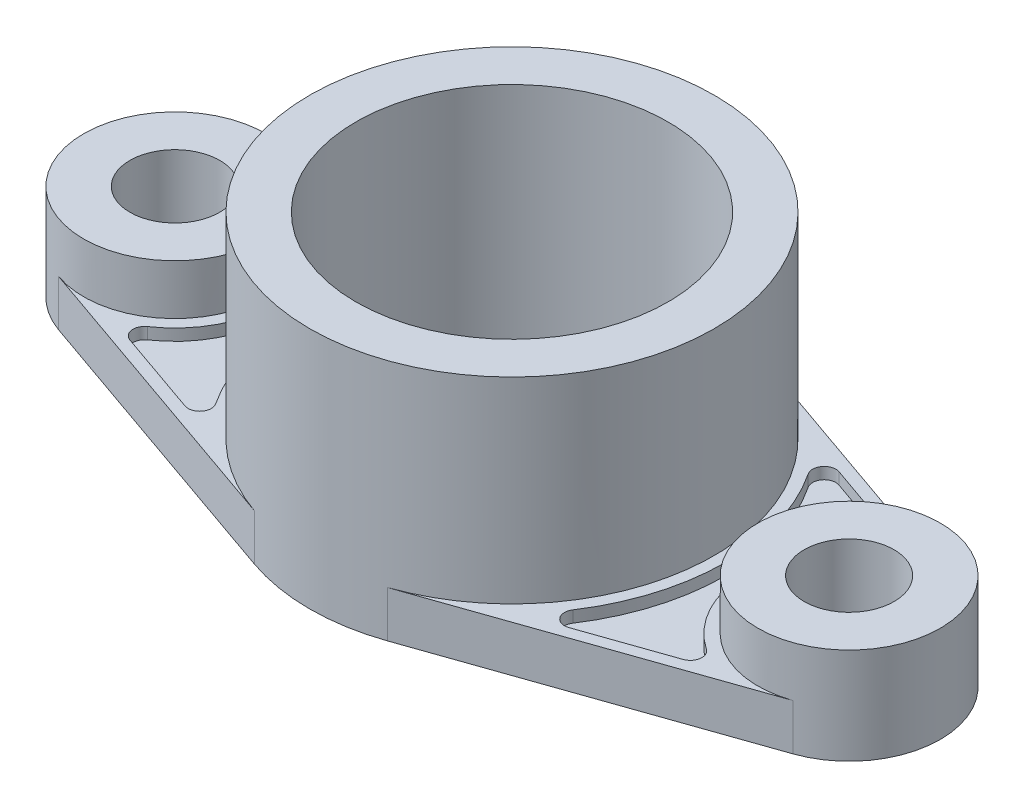
ISO-10303-21;
HEADER;
FILE_DESCRIPTION(('STEP AP214'),'2;1');
FILE_NAME('part.step','',(''),(''),'','','');
FILE_SCHEMA(('AUTOMOTIVE_DESIGN { 1 0 10303 214 1 1 1 1 }'));
ENDSEC;
DATA;
#1=APPLICATION_CONTEXT('core data for automotive mechanical design processes');
#2=APPLICATION_PROTOCOL_DEFINITION('international standard','automotive_design',2000,#1);
#3=PRODUCT_CONTEXT('',#1,'mechanical');
#4=PRODUCT('Part','Part','',(#3));
#5=PRODUCT_RELATED_PRODUCT_CATEGORY('part','',(#4));
#6=PRODUCT_DEFINITION_FORMATION('','',#4);
#7=PRODUCT_DEFINITION_CONTEXT('part definition',#1,'design');
#8=PRODUCT_DEFINITION('design','',#6,#7);
#9=PRODUCT_DEFINITION_SHAPE('','',#8);
#10=(LENGTH_UNIT() NAMED_UNIT(*) SI_UNIT(.MILLI.,.METRE.));
#11=(NAMED_UNIT(*) PLANE_ANGLE_UNIT() SI_UNIT($,.RADIAN.));
#12=(NAMED_UNIT(*) SI_UNIT($,.STERADIAN.) SOLID_ANGLE_UNIT());
#13=UNCERTAINTY_MEASURE_WITH_UNIT(LENGTH_MEASURE(1.E-05),#10,'distance_accuracy_value','');
#14=(GEOMETRIC_REPRESENTATION_CONTEXT(3) GLOBAL_UNCERTAINTY_ASSIGNED_CONTEXT((#13)) GLOBAL_UNIT_ASSIGNED_CONTEXT((#10,
#11,#12)) REPRESENTATION_CONTEXT('',''));
#15=CARTESIAN_POINT('',(0.,0.,0.));
#16=DIRECTION('',(0.,0.,1.));
#17=DIRECTION('',(1.,0.,0.));
#18=AXIS2_PLACEMENT_3D('',#15,#16,#17);
#19=CARTESIAN_POINT('',(0.,9.,0.));
#20=DIRECTION('',(0.,-1.,0.));
#21=DIRECTION('',(0.,0.,-1.));
#22=AXIS2_PLACEMENT_3D('',#19,#20,#21);
#23=CYLINDRICAL_SURFACE('',#22,52.5);
#24=CARTESIAN_POINT('',(0.,63.,0.));
#25=DIRECTION('',(0.,1.,0.));
#26=DIRECTION('',(0.,0.,1.));
#27=AXIS2_PLACEMENT_3D('',#24,#25,#26);
#28=CIRCLE('',#27,52.5);
#29=CARTESIAN_POINT('',(0.,63.,52.5));
#30=VERTEX_POINT('',#29);
#31=EDGE_CURVE('E343',#30,#30,#28,.F.);
#32=ORIENTED_EDGE('',*,*,#31,.T.);
#33=EDGE_LOOP('',(#32));
#34=FACE_BOUND('',#33,.T.);
#35=DIRECTION('',(0.,-1.,0.));
#36=VECTOR('',#35,1.);
#37=CARTESIAN_POINT('',(-17.3,9.,-49.5677314389109));
#38=LINE('',#37,#36);
#39=CARTESIAN_POINT('',(-17.3,12.,-49.5677314389109));
#40=VERTEX_POINT('',#39);
#41=CARTESIAN_POINT('',(-17.3,0.,-49.5677314389109));
#42=VERTEX_POINT('',#41);
#43=EDGE_CURVE('E394',#40,#42,#38,.T.);
#44=ORIENTED_EDGE('',*,*,#43,.F.);
#45=CARTESIAN_POINT('',(0.,12.,0.));
#46=DIRECTION('',(0.,-1.,0.));
#47=DIRECTION('',(0.,0.,1.));
#48=AXIS2_PLACEMENT_3D('',#45,#46,#47);
#49=CIRCLE('',#48,52.5);
#50=CARTESIAN_POINT('',(-17.3,12.,49.5677314389109));
#51=VERTEX_POINT('',#50);
#52=EDGE_CURVE('E212',#51,#40,#49,.T.);
#53=ORIENTED_EDGE('',*,*,#52,.F.);
#54=DIRECTION('',(0.,-1.,0.));
#55=VECTOR('',#54,1.);
#56=CARTESIAN_POINT('',(-17.3,9.,49.5677314389109));
#57=LINE('',#56,#55);
#58=CARTESIAN_POINT('',(-17.3,0.,49.5677314389109));
#59=VERTEX_POINT('',#58);
#60=EDGE_CURVE('E46',#51,#59,#57,.T.);
#61=ORIENTED_EDGE('',*,*,#60,.T.);
#62=CARTESIAN_POINT('',(0.,0.,0.));
#63=DIRECTION('',(0.,1.,0.));
#64=DIRECTION('',(0.,0.,1.));
#65=AXIS2_PLACEMENT_3D('',#62,#63,#64);
#66=CIRCLE('',#65,52.5);
#67=CARTESIAN_POINT('',(17.3,0.,49.5677314389109));
#68=VERTEX_POINT('',#67);
#69=EDGE_CURVE('E370',#68,#59,#66,.F.);
#70=ORIENTED_EDGE('',*,*,#69,.F.);
#71=DIRECTION('',(0.,-1.,0.));
#72=VECTOR('',#71,1.);
#73=CARTESIAN_POINT('',(17.3,9.,49.5677314389109));
#74=LINE('',#73,#72);
#75=CARTESIAN_POINT('',(17.3,12.,49.5677314389109));
#76=VERTEX_POINT('',#75);
#77=EDGE_CURVE('E403',#76,#68,#74,.T.);
#78=ORIENTED_EDGE('',*,*,#77,.F.);
#79=CARTESIAN_POINT('',(0.,12.,0.));
#80=DIRECTION('',(0.,-1.,0.));
#81=DIRECTION('',(0.,0.,1.));
#82=AXIS2_PLACEMENT_3D('',#79,#80,#81);
#83=CIRCLE('',#82,52.5);
#84=CARTESIAN_POINT('',(17.3,12.,-49.5677314389109));
#85=VERTEX_POINT('',#84);
#86=EDGE_CURVE('E331',#85,#76,#83,.T.);
#87=ORIENTED_EDGE('',*,*,#86,.F.);
#88=DIRECTION('',(0.,-1.,0.));
#89=VECTOR('',#88,1.);
#90=CARTESIAN_POINT('',(17.3,9.,-49.5677314389109));
#91=LINE('',#90,#89);
#92=CARTESIAN_POINT('',(17.3,0.,-49.5677314389109));
#93=VERTEX_POINT('',#92);
#94=EDGE_CURVE('E396',#85,#93,#91,.T.);
#95=ORIENTED_EDGE('',*,*,#94,.T.);
#96=EDGE_CURVE('E374',#42,#93,#66,.F.);
#97=ORIENTED_EDGE('',*,*,#96,.F.);
#98=EDGE_LOOP('',(#44,#53,#61,#70,#78,#87,#95,#97));
#99=FACE_BOUND('',#98,.T.);
#100=ADVANCED_FACE('F38',(#34,#99),#23,.T.);
#101=CARTESIAN_POINT('',(-87.5,9.,0.));
#102=DIRECTION('',(0.,-1.,0.));
#103=DIRECTION('',(0.,0.,-1.));
#104=AXIS2_PLACEMENT_3D('',#101,#102,#103);
#105=CYLINDRICAL_SURFACE('',#104,23.6666666666667);
#106=CARTESIAN_POINT('',(-87.5,12.,0.));
#107=DIRECTION('',(0.,-1.,0.));
#108=DIRECTION('',(0.,0.,1.));
#109=AXIS2_PLACEMENT_3D('',#106,#107,#108);
#110=CIRCLE('',#109,23.6666666666667);
#111=CARTESIAN_POINT('',(-95.2987301587302,12.,-22.3448186169059));
#112=VERTEX_POINT('',#111);
#113=CARTESIAN_POINT('',(-95.2987301587301,12.,22.3448186169059));
#114=VERTEX_POINT('',#113);
#115=EDGE_CURVE('E268',#112,#114,#110,.T.);
#116=ORIENTED_EDGE('',*,*,#115,.F.);
#117=DIRECTION('',(0.,-1.,0.));
#118=VECTOR('',#117,1.);
#119=CARTESIAN_POINT('',(-95.2987301587302,9.,-22.3448186169059));
#120=LINE('',#119,#118);
#121=CARTESIAN_POINT('',(-95.2987301587302,0.,-22.3448186169059));
#122=VERTEX_POINT('',#121);
#123=EDGE_CURVE('E392',#112,#122,#120,.T.);
#124=ORIENTED_EDGE('',*,*,#123,.T.);
#125=CARTESIAN_POINT('',(-87.5,0.,0.));
#126=DIRECTION('',(0.,1.,0.));
#127=DIRECTION('',(0.,0.,1.));
#128=AXIS2_PLACEMENT_3D('',#125,#126,#127);
#129=CIRCLE('',#128,23.6666666666667);
#130=CARTESIAN_POINT('',(-95.2987301587301,0.,22.3448186169059));
#131=VERTEX_POINT('',#130);
#132=EDGE_CURVE('E364',#131,#122,#129,.F.);
#133=ORIENTED_EDGE('',*,*,#132,.F.);
#134=DIRECTION('',(0.,-1.,0.));
#135=VECTOR('',#134,1.);
#136=CARTESIAN_POINT('',(-95.2987301587301,9.,22.3448186169059));
#137=LINE('',#136,#135);
#138=EDGE_CURVE('E12',#114,#131,#137,.T.);
#139=ORIENTED_EDGE('',*,*,#138,.F.);
#140=EDGE_LOOP('',(#116,#124,#133,#139));
#141=FACE_BOUND('',#140,.T.);
#142=CARTESIAN_POINT('',(-87.5,25.,0.));
#143=DIRECTION('',(0.,1.,0.));
#144=DIRECTION('',(0.,0.,1.));
#145=AXIS2_PLACEMENT_3D('',#142,#143,#144);
#146=CIRCLE('',#145,23.6666666666667);
#147=CARTESIAN_POINT('',(-87.5,25.,23.6666666666667));
#148=VERTEX_POINT('',#147);
#149=EDGE_CURVE('E355',#148,#148,#146,.F.);
#150=ORIENTED_EDGE('',*,*,#149,.T.);
#151=EDGE_LOOP('',(#150));
#152=FACE_BOUND('',#151,.T.);
#153=ADVANCED_FACE('F437',(#141,#152),#105,.T.);
#154=CARTESIAN_POINT('',(-17.3,9.,49.5677314389109));
#155=DIRECTION('',(-0.329523809523809,0.,0.944147265503065));
#156=DIRECTION('',(0.944147265503066,0.,0.329523809523809));
#157=AXIS2_PLACEMENT_3D('',#154,#155,#156);
#158=PLANE('',#157);
#159=DIRECTION('',(-0.944147265503066,0.,-0.329523809523809));
#160=VECTOR('',#159,1.);
#161=CARTESIAN_POINT('',(-17.3,0.,49.5677314389109));
#162=LINE('',#161,#160);
#163=EDGE_CURVE('E367',#59,#131,#162,.T.);
#164=ORIENTED_EDGE('',*,*,#163,.F.);
#165=ORIENTED_EDGE('',*,*,#60,.F.);
#166=DIRECTION('',(0.944147265503065,0.,0.329523809523809));
#167=VECTOR('',#166,1.);
#168=CARTESIAN_POINT('',(-95.2987301587301,12.,22.3448186169059));
#169=LINE('',#168,#167);
#170=EDGE_CURVE('E271',#114,#51,#169,.T.);
#171=ORIENTED_EDGE('',*,*,#170,.F.);
#172=ORIENTED_EDGE('',*,*,#138,.T.);
#173=EDGE_LOOP('',(#164,#165,#171,#172));
#174=FACE_BOUND('',#173,.T.);
#175=ADVANCED_FACE('F410',(#174),#158,.T.);
#176=CARTESIAN_POINT('',(17.3,9.,49.5677314389109));
#177=DIRECTION('',(-0.329523809523809,0.,-0.944147265503065));
#178=DIRECTION('',(-0.944147265503066,0.,0.329523809523809));
#179=AXIS2_PLACEMENT_3D('',#176,#177,#178);
#180=PLANE('',#179);
#181=DIRECTION('',(0.944147265503066,0.,-0.329523809523809));
#182=VECTOR('',#181,1.);
#183=CARTESIAN_POINT('',(17.3,0.,49.5677314389109));
#184=LINE('',#183,#182);
#185=CARTESIAN_POINT('',(95.2987301587302,0.,22.3448186169059));
#186=VERTEX_POINT('',#185);
#187=EDGE_CURVE('E373',#68,#186,#184,.T.);
#188=ORIENTED_EDGE('',*,*,#187,.T.);
#189=DIRECTION('',(0.,-1.,0.));
#190=VECTOR('',#189,1.);
#191=CARTESIAN_POINT('',(95.2987301587302,9.,22.3448186169059));
#192=LINE('',#191,#190);
#193=CARTESIAN_POINT('',(95.2987301587302,12.,22.3448186169059));
#194=VERTEX_POINT('',#193);
#195=EDGE_CURVE('E400',#194,#186,#192,.T.);
#196=ORIENTED_EDGE('',*,*,#195,.F.);
#197=DIRECTION('',(0.944147265503066,0.,-0.329523809523809));
#198=VECTOR('',#197,1.);
#199=CARTESIAN_POINT('',(17.3,12.,49.5677314389109));
#200=LINE('',#199,#198);
#201=EDGE_CURVE('E334',#76,#194,#200,.T.);
#202=ORIENTED_EDGE('',*,*,#201,.F.);
#203=ORIENTED_EDGE('',*,*,#77,.T.);
#204=EDGE_LOOP('',(#188,#196,#202,#203));
#205=FACE_BOUND('',#204,.T.);
#206=ADVANCED_FACE('F418',(#205),#180,.F.);
#207=CARTESIAN_POINT('',(87.5,9.,0.));
#208=DIRECTION('',(0.,-1.,0.));
#209=DIRECTION('',(0.,0.,-1.));
#210=AXIS2_PLACEMENT_3D('',#207,#208,#209);
#211=CYLINDRICAL_SURFACE('',#210,23.6666666666667);
#212=CARTESIAN_POINT('',(87.5,12.,0.));
#213=DIRECTION('',(0.,-1.,0.));
#214=DIRECTION('',(0.,0.,1.));
#215=AXIS2_PLACEMENT_3D('',#212,#213,#214);
#216=CIRCLE('',#215,23.6666666666667);
#217=CARTESIAN_POINT('',(95.2987301587302,12.,-22.3448186169059));
#218=VERTEX_POINT('',#217);
#219=EDGE_CURVE('E337',#194,#218,#216,.T.);
#220=ORIENTED_EDGE('',*,*,#219,.F.);
#221=ORIENTED_EDGE('',*,*,#195,.T.);
#222=CARTESIAN_POINT('',(87.5,0.,0.));
#223=DIRECTION('',(0.,1.,0.));
#224=DIRECTION('',(0.,0.,1.));
#225=AXIS2_PLACEMENT_3D('',#222,#223,#224);
#226=CIRCLE('',#225,23.6666666666667);
#227=CARTESIAN_POINT('',(95.2987301587302,0.,-22.3448186169059));
#228=VERTEX_POINT('',#227);
#229=EDGE_CURVE('E377',#186,#228,#226,.T.);
#230=ORIENTED_EDGE('',*,*,#229,.T.);
#231=DIRECTION('',(0.,-1.,0.));
#232=VECTOR('',#231,1.);
#233=CARTESIAN_POINT('',(95.2987301587302,9.,-22.3448186169059));
#234=LINE('',#233,#232);
#235=EDGE_CURVE('E398',#218,#228,#234,.T.);
#236=ORIENTED_EDGE('',*,*,#235,.F.);
#237=EDGE_LOOP('',(#220,#221,#230,#236));
#238=FACE_BOUND('',#237,.T.);
#239=CARTESIAN_POINT('',(87.5,25.,0.));
#240=DIRECTION('',(0.,1.,0.));
#241=DIRECTION('',(0.,0.,1.));
#242=AXIS2_PLACEMENT_3D('',#239,#240,#241);
#243=CIRCLE('',#242,23.6666666666667);
#244=CARTESIAN_POINT('',(87.5,25.,23.6666666666667));
#245=VERTEX_POINT('',#244);
#246=EDGE_CURVE('E352',#245,#245,#243,.T.);
#247=ORIENTED_EDGE('',*,*,#246,.F.);
#248=EDGE_LOOP('',(#247));
#249=FACE_BOUND('',#248,.T.);
#250=ADVANCED_FACE('F458',(#238,#249),#211,.T.);
#251=CARTESIAN_POINT('',(17.3,9.,-49.5677314389109));
#252=DIRECTION('',(0.329523809523809,0.,-0.944147265503065));
#253=DIRECTION('',(-0.944147265503066,0.,-0.329523809523809));
#254=AXIS2_PLACEMENT_3D('',#251,#252,#253);
#255=PLANE('',#254);
#256=DIRECTION('',(0.944147265503066,0.,0.329523809523809));
#257=VECTOR('',#256,1.);
#258=CARTESIAN_POINT('',(17.3,0.,-49.5677314389109));
#259=LINE('',#258,#257);
#260=EDGE_CURVE('E380',#93,#228,#259,.T.);
#261=ORIENTED_EDGE('',*,*,#260,.F.);
#262=ORIENTED_EDGE('',*,*,#94,.F.);
#263=DIRECTION('',(-0.944147265503065,0.,-0.329523809523809));
#264=VECTOR('',#263,1.);
#265=CARTESIAN_POINT('',(95.2987301587302,12.,-22.3448186169059));
#266=LINE('',#265,#264);
#267=EDGE_CURVE('E340',#218,#85,#266,.T.);
#268=ORIENTED_EDGE('',*,*,#267,.F.);
#269=ORIENTED_EDGE('',*,*,#235,.T.);
#270=EDGE_LOOP('',(#261,#262,#268,#269));
#271=FACE_BOUND('',#270,.T.);
#272=ADVANCED_FACE('F429',(#271),#255,.T.);
#273=CARTESIAN_POINT('',(-87.5,9.,0.));
#274=DIRECTION('',(0.,-1.,0.));
#275=DIRECTION('',(0.,0.,-1.));
#276=AXIS2_PLACEMENT_3D('',#273,#274,#275);
#277=CYLINDRICAL_SURFACE('',#276,11.6666666666667);
#278=CARTESIAN_POINT('',(-87.5,0.,0.));
#279=DIRECTION('',(0.,1.,0.));
#280=DIRECTION('',(0.,0.,1.));
#281=AXIS2_PLACEMENT_3D('',#278,#279,#280);
#282=CIRCLE('',#281,11.6666666666667);
#283=CARTESIAN_POINT('',(-87.5,0.,11.6666666666667));
#284=VERTEX_POINT('',#283);
#285=EDGE_CURVE('E386',#284,#284,#282,.F.);
#286=ORIENTED_EDGE('',*,*,#285,.T.);
#287=EDGE_LOOP('',(#286));
#288=FACE_BOUND('',#287,.T.);
#289=CARTESIAN_POINT('',(-87.5,25.,0.));
#290=DIRECTION('',(0.,1.,0.));
#291=DIRECTION('',(0.,0.,1.));
#292=AXIS2_PLACEMENT_3D('',#289,#290,#291);
#293=CIRCLE('',#292,11.6666666666667);
#294=CARTESIAN_POINT('',(-87.5,25.,11.6666666666667));
#295=VERTEX_POINT('',#294);
#296=EDGE_CURVE('E358',#295,#295,#293,.F.);
#297=ORIENTED_EDGE('',*,*,#296,.F.);
#298=EDGE_LOOP('',(#297));
#299=FACE_BOUND('',#298,.T.);
#300=ADVANCED_FACE('F449',(#288,#299),#277,.F.);
#301=CARTESIAN_POINT('',(-17.3,9.,-49.5677314389109));
#302=DIRECTION('',(0.32952380952381,0.,0.944147265503065));
#303=DIRECTION('',(0.944147265503066,0.,-0.32952380952381));
#304=AXIS2_PLACEMENT_3D('',#301,#302,#303);
#305=PLANE('',#304);
#306=DIRECTION('',(-0.944147265503066,0.,0.32952380952381));
#307=VECTOR('',#306,1.);
#308=CARTESIAN_POINT('',(-17.3,0.,-49.5677314389109));
#309=LINE('',#308,#307);
#310=EDGE_CURVE('E383',#42,#122,#309,.T.);
#311=ORIENTED_EDGE('',*,*,#310,.T.);
#312=ORIENTED_EDGE('',*,*,#123,.F.);
#313=DIRECTION('',(-0.944147265503066,0.,0.32952380952381));
#314=VECTOR('',#313,1.);
#315=CARTESIAN_POINT('',(-17.3,12.,-49.5677314389109));
#316=LINE('',#315,#314);
#317=EDGE_CURVE('E265',#40,#112,#316,.T.);
#318=ORIENTED_EDGE('',*,*,#317,.F.);
#319=ORIENTED_EDGE('',*,*,#43,.T.);
#320=EDGE_LOOP('',(#311,#312,#318,#319));
#321=FACE_BOUND('',#320,.T.);
#322=ADVANCED_FACE('F433',(#321),#305,.F.);
#323=CARTESIAN_POINT('',(0.,9.,0.));
#324=DIRECTION('',(0.,-1.,0.));
#325=DIRECTION('',(0.,0.,-1.));
#326=AXIS2_PLACEMENT_3D('',#323,#324,#325);
#327=CYLINDRICAL_SURFACE('',#326,40.5);
#328=CARTESIAN_POINT('',(0.,0.,0.));
#329=DIRECTION('',(0.,1.,0.));
#330=DIRECTION('',(0.,0.,1.));
#331=AXIS2_PLACEMENT_3D('',#328,#329,#330);
#332=CIRCLE('',#331,40.5);
#333=CARTESIAN_POINT('',(0.,0.,40.5));
#334=VERTEX_POINT('',#333);
#335=EDGE_CURVE('E361',#334,#334,#332,.F.);
#336=ORIENTED_EDGE('',*,*,#335,.T.);
#337=EDGE_LOOP('',(#336));
#338=FACE_BOUND('',#337,.T.);
#339=CARTESIAN_POINT('',(0.,63.,0.));
#340=DIRECTION('',(0.,1.,0.));
#341=DIRECTION('',(0.,0.,1.));
#342=AXIS2_PLACEMENT_3D('',#339,#340,#341);
#343=CIRCLE('',#342,40.5);
#344=CARTESIAN_POINT('',(0.,63.,40.5));
#345=VERTEX_POINT('',#344);
#346=EDGE_CURVE('E344',#345,#345,#343,.F.);
#347=ORIENTED_EDGE('',*,*,#346,.F.);
#348=EDGE_LOOP('',(#347));
#349=FACE_BOUND('',#348,.T.);
#350=ADVANCED_FACE('F40',(#338,#349),#327,.F.);
#351=CARTESIAN_POINT('',(87.5,9.,0.));
#352=DIRECTION('',(0.,-1.,0.));
#353=DIRECTION('',(0.,0.,-1.));
#354=AXIS2_PLACEMENT_3D('',#351,#352,#353);
#355=CYLINDRICAL_SURFACE('',#354,11.6666666666667);
#356=CARTESIAN_POINT('',(87.5,0.,0.));
#357=DIRECTION('',(0.,1.,0.));
#358=DIRECTION('',(0.,0.,1.));
#359=AXIS2_PLACEMENT_3D('',#356,#357,#358);
#360=CIRCLE('',#359,11.6666666666667);
#361=CARTESIAN_POINT('',(87.5,0.,11.6666666666667));
#362=VERTEX_POINT('',#361);
#363=EDGE_CURVE('E389',#362,#362,#360,.T.);
#364=ORIENTED_EDGE('',*,*,#363,.F.);
#365=EDGE_LOOP('',(#364));
#366=FACE_BOUND('',#365,.T.);
#367=CARTESIAN_POINT('',(87.5,25.,0.));
#368=DIRECTION('',(0.,1.,0.));
#369=DIRECTION('',(0.,0.,1.));
#370=AXIS2_PLACEMENT_3D('',#367,#368,#369);
#371=CIRCLE('',#370,11.6666666666667);
#372=CARTESIAN_POINT('',(87.5,25.,11.6666666666667));
#373=VERTEX_POINT('',#372);
#374=EDGE_CURVE('E347',#373,#373,#371,.T.);
#375=ORIENTED_EDGE('',*,*,#374,.T.);
#376=EDGE_LOOP('',(#375));
#377=FACE_BOUND('',#376,.T.);
#378=ADVANCED_FACE('F743',(#366,#377),#355,.F.);
#379=CARTESIAN_POINT('',(0.,0.,0.));
#380=DIRECTION('',(0.,1.,0.));
#381=DIRECTION('',(0.,0.,1.));
#382=AXIS2_PLACEMENT_3D('',#379,#380,#381);
#383=PLANE('',#382);
#384=ORIENTED_EDGE('',*,*,#310,.F.);
#385=ORIENTED_EDGE('',*,*,#96,.T.);
#386=ORIENTED_EDGE('',*,*,#260,.T.);
#387=ORIENTED_EDGE('',*,*,#229,.F.);
#388=ORIENTED_EDGE('',*,*,#187,.F.);
#389=ORIENTED_EDGE('',*,*,#69,.T.);
#390=ORIENTED_EDGE('',*,*,#163,.T.);
#391=ORIENTED_EDGE('',*,*,#132,.T.);
#392=EDGE_LOOP('',(#384,#385,#386,#387,#388,#389,#390,#391));
#393=FACE_BOUND('',#392,.T.);
#394=ORIENTED_EDGE('',*,*,#285,.F.);
#395=EDGE_LOOP('',(#394));
#396=FACE_BOUND('',#395,.T.);
#397=ORIENTED_EDGE('',*,*,#335,.F.);
#398=EDGE_LOOP('',(#397));
#399=FACE_BOUND('',#398,.T.);
#400=ORIENTED_EDGE('',*,*,#363,.T.);
#401=EDGE_LOOP('',(#400));
#402=FACE_BOUND('',#401,.T.);
#403=ADVANCED_FACE('F415',(#393,#396,#399,#402),#383,.F.);
#404=CARTESIAN_POINT('',(0.,25.,0.));
#405=DIRECTION('',(0.,1.,0.));
#406=DIRECTION('',(0.,0.,1.));
#407=AXIS2_PLACEMENT_3D('',#404,#405,#406);
#408=PLANE('',#407);
#409=ORIENTED_EDGE('',*,*,#149,.F.);
#410=EDGE_LOOP('',(#409));
#411=FACE_BOUND('',#410,.T.);
#412=ORIENTED_EDGE('',*,*,#296,.T.);
#413=EDGE_LOOP('',(#412));
#414=FACE_BOUND('',#413,.T.);
#415=ADVANCED_FACE('F442',(#411,#414),#408,.T.);
#416=CARTESIAN_POINT('',(0.,25.,0.));
#417=DIRECTION('',(0.,1.,0.));
#418=DIRECTION('',(0.,0.,1.));
#419=AXIS2_PLACEMENT_3D('',#416,#417,#418);
#420=PLANE('',#419);
#421=ORIENTED_EDGE('',*,*,#374,.F.);
#422=EDGE_LOOP('',(#421));
#423=FACE_BOUND('',#422,.T.);
#424=ORIENTED_EDGE('',*,*,#246,.T.);
#425=EDGE_LOOP('',(#424));
#426=FACE_BOUND('',#425,.T.);
#427=ADVANCED_FACE('F445',(#423,#426),#420,.T.);
#428=CARTESIAN_POINT('',(0.,63.,0.));
#429=DIRECTION('',(0.,1.,0.));
#430=DIRECTION('',(0.,0.,1.));
#431=AXIS2_PLACEMENT_3D('',#428,#429,#430);
#432=PLANE('',#431);
#433=ORIENTED_EDGE('',*,*,#31,.F.);
#434=EDGE_LOOP('',(#433));
#435=FACE_BOUND('',#434,.T.);
#436=ORIENTED_EDGE('',*,*,#346,.T.);
#437=EDGE_LOOP('',(#436));
#438=FACE_BOUND('',#437,.T.);
#439=ADVANCED_FACE('F508',(#435,#438),#432,.T.);
#440=CARTESIAN_POINT('',(0.,12.,0.));
#441=DIRECTION('',(0.,1.,0.));
#442=DIRECTION('',(0.,0.,1.));
#443=AXIS2_PLACEMENT_3D('',#440,#441,#442);
#444=PLANE('',#443);
#445=ORIENTED_EDGE('',*,*,#86,.T.);
#446=ORIENTED_EDGE('',*,*,#201,.T.);
#447=ORIENTED_EDGE('',*,*,#219,.T.);
#448=ORIENTED_EDGE('',*,*,#267,.T.);
#449=EDGE_LOOP('',(#445,#446,#447,#448));
#450=FACE_BOUND('',#449,.T.);
#451=DIRECTION('',(-0.944147265503065,0.,-0.329523809523809));
#452=VECTOR('',#451,1.);
#453=CARTESIAN_POINT('',(71.8085324447649,12.,-27.3658355815077));
#454=LINE('',#453,#452);
#455=CARTESIAN_POINT('',(71.8085324447649,12.,-27.3658355815077));
#456=VERTEX_POINT('',#455);
#457=CARTESIAN_POINT('',(49.8253318696974,12.,-35.0383547569591));
#458=VERTEX_POINT('',#457);
#459=EDGE_CURVE('E277',#456,#458,#454,.T.);
#460=ORIENTED_EDGE('',*,*,#459,.F.);
#461=CARTESIAN_POINT('',(70.8199610161934,12.,-24.5333937849985));
#462=DIRECTION('',(0.,1.,0.));
#463=DIRECTION('',(0.,0.,1.));
#464=AXIS2_PLACEMENT_3D('',#461,#462,#463);
#465=CIRCLE('',#464,3.00000000000001);
#466=CARTESIAN_POINT('',(72.5067065314098,12.,-22.0524887955043));
#467=VERTEX_POINT('',#466);
#468=EDGE_CURVE('E275',#467,#456,#465,.T.);
#469=ORIENTED_EDGE('',*,*,#468,.F.);
#470=CARTESIAN_POINT('',(87.5,12.,0.));
#471=DIRECTION('',(0.,-1.,0.));
#472=DIRECTION('',(0.,0.,1.));
#473=AXIS2_PLACEMENT_3D('',#470,#471,#472);
#474=CIRCLE('',#473,26.6666666666667);
#475=CARTESIAN_POINT('',(72.5067065314098,12.,22.0524887955043));
#476=VERTEX_POINT('',#475);
#477=EDGE_CURVE('E291',#476,#467,#474,.T.);
#478=ORIENTED_EDGE('',*,*,#477,.F.);
#479=CARTESIAN_POINT('',(70.8199610161934,12.,24.5333937849985));
#480=DIRECTION('',(0.,1.,0.));
#481=DIRECTION('',(0.,0.,1.));
#482=AXIS2_PLACEMENT_3D('',#479,#480,#481);
#483=CIRCLE('',#482,3.);
#484=CARTESIAN_POINT('',(71.8085324447648,12.,27.3658355815077));
#485=VERTEX_POINT('',#484);
#486=EDGE_CURVE('E288',#485,#476,#483,.T.);
#487=ORIENTED_EDGE('',*,*,#486,.F.);
#488=DIRECTION('',(0.944147265503065,0.,-0.329523809523809));
#489=VECTOR('',#488,1.);
#490=CARTESIAN_POINT('',(49.8253318696974,12.,35.038354756959));
#491=LINE('',#490,#489);
#492=CARTESIAN_POINT('',(49.8253318696974,12.,35.038354756959));
#493=VERTEX_POINT('',#492);
#494=EDGE_CURVE('E286',#493,#485,#491,.T.);
#495=ORIENTED_EDGE('',*,*,#494,.F.);
#496=CARTESIAN_POINT('',(48.836760441126,12.,32.2059129604499));
#497=DIRECTION('',(0.,1.,0.));
#498=DIRECTION('',(0.,0.,1.));
#499=AXIS2_PLACEMENT_3D('',#496,#497,#498);
#500=CIRCLE('',#499,3.);
#501=CARTESIAN_POINT('',(46.3323111877349,12.,30.5543276804268));
#502=VERTEX_POINT('',#501);
#503=EDGE_CURVE('E284',#502,#493,#500,.T.);
#504=ORIENTED_EDGE('',*,*,#503,.F.);
#505=CARTESIAN_POINT('',(0.,12.,0.));
#506=DIRECTION('',(0.,-1.,0.));
#507=DIRECTION('',(0.,0.,1.));
#508=AXIS2_PLACEMENT_3D('',#505,#506,#507);
#509=CIRCLE('',#508,55.5);
#510=CARTESIAN_POINT('',(46.3323111877349,12.,-30.5543276804268));
#511=VERTEX_POINT('',#510);
#512=EDGE_CURVE('E282',#511,#502,#509,.T.);
#513=ORIENTED_EDGE('',*,*,#512,.F.);
#514=CARTESIAN_POINT('',(48.836760441126,12.,-32.2059129604499));
#515=DIRECTION('',(0.,1.,0.));
#516=DIRECTION('',(0.,0.,-1.));
#517=AXIS2_PLACEMENT_3D('',#514,#515,#516);
#518=CIRCLE('',#517,2.99999999999999);
#519=EDGE_CURVE('E280',#458,#511,#518,.T.);
#520=ORIENTED_EDGE('',*,*,#519,.F.);
#521=EDGE_LOOP('',(#460,#469,#478,#487,#495,#504,#513,#520));
#522=FACE_BOUND('',#521,.T.);
#523=ADVANCED_FACE('F426',(#450,#522),#444,.T.);
#524=CARTESIAN_POINT('',(70.8199610161934,12.,-24.5333937849985));
#525=DIRECTION('',(0.,-1.,0.));
#526=DIRECTION('',(0.,0.,-1.));
#527=AXIS2_PLACEMENT_3D('',#524,#525,#526);
#528=CYLINDRICAL_SURFACE('',#527,3.00000000000001);
#529=CARTESIAN_POINT('',(70.8199610161934,9.,-24.5333937849985));
#530=DIRECTION('',(0.,1.,0.));
#531=DIRECTION('',(0.,0.,1.));
#532=AXIS2_PLACEMENT_3D('',#529,#530,#531);
#533=CIRCLE('',#532,3.00000000000001);
#534=CARTESIAN_POINT('',(72.5067065314098,9.,-22.0524887955043));
#535=VERTEX_POINT('',#534);
#536=CARTESIAN_POINT('',(71.8085324447649,9.,-27.3658355815077));
#537=VERTEX_POINT('',#536);
#538=EDGE_CURVE('E274',#535,#537,#533,.T.);
#539=ORIENTED_EDGE('',*,*,#538,.F.);
#540=DIRECTION('',(0.,-1.,0.));
#541=VECTOR('',#540,1.);
#542=CARTESIAN_POINT('',(72.5067065314098,12.,-22.0524887955043));
#543=LINE('',#542,#541);
#544=EDGE_CURVE('E293',#467,#535,#543,.T.);
#545=ORIENTED_EDGE('',*,*,#544,.F.);
#546=ORIENTED_EDGE('',*,*,#468,.T.);
#547=DIRECTION('',(0.,-1.,0.));
#548=VECTOR('',#547,1.);
#549=CARTESIAN_POINT('',(71.8085324447649,12.,-27.3658355815077));
#550=LINE('',#549,#548);
#551=EDGE_CURVE('E328',#456,#537,#550,.T.);
#552=ORIENTED_EDGE('',*,*,#551,.T.);
#553=EDGE_LOOP('',(#539,#545,#546,#552));
#554=FACE_BOUND('',#553,.T.);
#555=ADVANCED_FACE('F507',(#554),#528,.F.);
#556=CARTESIAN_POINT('',(71.8085324447649,12.,-27.3658355815077));
#557=DIRECTION('',(-0.329523809523809,0.,0.944147265503066));
#558=DIRECTION('',(0.944147265503066,0.,0.329523809523809));
#559=AXIS2_PLACEMENT_3D('',#556,#557,#558);
#560=PLANE('',#559);
#561=DIRECTION('',(-0.944147265503065,0.,-0.329523809523809));
#562=VECTOR('',#561,1.);
#563=CARTESIAN_POINT('',(71.8085324447649,9.,-27.3658355815077));
#564=LINE('',#563,#562);
#565=CARTESIAN_POINT('',(49.8253318696974,9.,-35.0383547569591));
#566=VERTEX_POINT('',#565);
#567=EDGE_CURVE('E295',#537,#566,#564,.T.);
#568=ORIENTED_EDGE('',*,*,#567,.F.);
#569=ORIENTED_EDGE('',*,*,#551,.F.);
#570=ORIENTED_EDGE('',*,*,#459,.T.);
#571=DIRECTION('',(0.,-1.,0.));
#572=VECTOR('',#571,1.);
#573=CARTESIAN_POINT('',(49.8253318696974,12.,-35.0383547569591));
#574=LINE('',#573,#572);
#575=EDGE_CURVE('E325',#458,#566,#574,.T.);
#576=ORIENTED_EDGE('',*,*,#575,.T.);
#577=EDGE_LOOP('',(#568,#569,#570,#576));
#578=FACE_BOUND('',#577,.T.);
#579=ADVANCED_FACE('F518',(#578),#560,.T.);
#580=CARTESIAN_POINT('',(48.836760441126,12.,-32.2059129604499));
#581=DIRECTION('',(0.,-1.,0.));
#582=DIRECTION('',(0.,0.,-1.));
#583=AXIS2_PLACEMENT_3D('',#580,#581,#582);
#584=CYLINDRICAL_SURFACE('',#583,2.99999999999999);
#585=CARTESIAN_POINT('',(48.836760441126,9.,-32.2059129604499));
#586=DIRECTION('',(0.,1.,0.));
#587=DIRECTION('',(0.,0.,-1.));
#588=AXIS2_PLACEMENT_3D('',#585,#586,#587);
#589=CIRCLE('',#588,2.99999999999999);
#590=CARTESIAN_POINT('',(46.3323111877349,9.,-30.5543276804268));
#591=VERTEX_POINT('',#590);
#592=EDGE_CURVE('E297',#566,#591,#589,.T.);
#593=ORIENTED_EDGE('',*,*,#592,.F.);
#594=ORIENTED_EDGE('',*,*,#575,.F.);
#595=ORIENTED_EDGE('',*,*,#519,.T.);
#596=DIRECTION('',(0.,-1.,0.));
#597=VECTOR('',#596,1.);
#598=CARTESIAN_POINT('',(46.3323111877349,12.,-30.5543276804268));
#599=LINE('',#598,#597);
#600=EDGE_CURVE('E322',#511,#591,#599,.T.);
#601=ORIENTED_EDGE('',*,*,#600,.T.);
#602=EDGE_LOOP('',(#593,#594,#595,#601));
#603=FACE_BOUND('',#602,.T.);
#604=ADVANCED_FACE('F528',(#603),#584,.F.);
#605=CARTESIAN_POINT('',(0.,12.,0.));
#606=DIRECTION('',(0.,-1.,0.));
#607=DIRECTION('',(0.,0.,-1.));
#608=AXIS2_PLACEMENT_3D('',#605,#606,#607);
#609=CYLINDRICAL_SURFACE('',#608,55.5);
#610=CARTESIAN_POINT('',(0.,9.,0.));
#611=DIRECTION('',(0.,-1.,0.));
#612=DIRECTION('',(0.,0.,1.));
#613=AXIS2_PLACEMENT_3D('',#610,#611,#612);
#614=CIRCLE('',#613,55.5);
#615=CARTESIAN_POINT('',(46.3323111877349,9.,30.5543276804268));
#616=VERTEX_POINT('',#615);
#617=EDGE_CURVE('E299',#591,#616,#614,.T.);
#618=ORIENTED_EDGE('',*,*,#617,.F.);
#619=ORIENTED_EDGE('',*,*,#600,.F.);
#620=ORIENTED_EDGE('',*,*,#512,.T.);
#621=DIRECTION('',(0.,-1.,0.));
#622=VECTOR('',#621,1.);
#623=CARTESIAN_POINT('',(46.3323111877349,12.,30.5543276804268));
#624=LINE('',#623,#622);
#625=EDGE_CURVE('E319',#502,#616,#624,.T.);
#626=ORIENTED_EDGE('',*,*,#625,.T.);
#627=EDGE_LOOP('',(#618,#619,#620,#626));
#628=FACE_BOUND('',#627,.T.);
#629=ADVANCED_FACE('F538',(#628),#609,.T.);
#630=CARTESIAN_POINT('',(48.836760441126,12.,32.2059129604499));
#631=DIRECTION('',(0.,-1.,0.));
#632=DIRECTION('',(0.,0.,-1.));
#633=AXIS2_PLACEMENT_3D('',#630,#631,#632);
#634=CYLINDRICAL_SURFACE('',#633,3.);
#635=CARTESIAN_POINT('',(48.836760441126,9.,32.2059129604499));
#636=DIRECTION('',(0.,1.,0.));
#637=DIRECTION('',(0.,0.,1.));
#638=AXIS2_PLACEMENT_3D('',#635,#636,#637);
#639=CIRCLE('',#638,3.);
#640=CARTESIAN_POINT('',(49.8253318696974,9.,35.038354756959));
#641=VERTEX_POINT('',#640);
#642=EDGE_CURVE('E301',#616,#641,#639,.T.);
#643=ORIENTED_EDGE('',*,*,#642,.F.);
#644=ORIENTED_EDGE('',*,*,#625,.F.);
#645=ORIENTED_EDGE('',*,*,#503,.T.);
#646=DIRECTION('',(0.,-1.,0.));
#647=VECTOR('',#646,1.);
#648=CARTESIAN_POINT('',(49.8253318696974,12.,35.038354756959));
#649=LINE('',#648,#647);
#650=EDGE_CURVE('E316',#493,#641,#649,.T.);
#651=ORIENTED_EDGE('',*,*,#650,.T.);
#652=EDGE_LOOP('',(#643,#644,#645,#651));
#653=FACE_BOUND('',#652,.T.);
#654=ADVANCED_FACE('F548',(#653),#634,.F.);
#655=CARTESIAN_POINT('',(49.8253318696974,12.,35.038354756959));
#656=DIRECTION('',(-0.329523809523809,0.,-0.944147265503066));
#657=DIRECTION('',(-0.944147265503066,0.,0.329523809523809));
#658=AXIS2_PLACEMENT_3D('',#655,#656,#657);
#659=PLANE('',#658);
#660=DIRECTION('',(0.944147265503065,0.,-0.329523809523809));
#661=VECTOR('',#660,1.);
#662=CARTESIAN_POINT('',(49.8253318696974,9.,35.038354756959));
#663=LINE('',#662,#661);
#664=CARTESIAN_POINT('',(71.8085324447648,9.,27.3658355815077));
#665=VERTEX_POINT('',#664);
#666=EDGE_CURVE('E303',#641,#665,#663,.T.);
#667=ORIENTED_EDGE('',*,*,#666,.F.);
#668=ORIENTED_EDGE('',*,*,#650,.F.);
#669=ORIENTED_EDGE('',*,*,#494,.T.);
#670=DIRECTION('',(0.,-1.,0.));
#671=VECTOR('',#670,1.);
#672=CARTESIAN_POINT('',(71.8085324447648,12.,27.3658355815077));
#673=LINE('',#672,#671);
#674=EDGE_CURVE('E313',#485,#665,#673,.T.);
#675=ORIENTED_EDGE('',*,*,#674,.T.);
#676=EDGE_LOOP('',(#667,#668,#669,#675));
#677=FACE_BOUND('',#676,.T.);
#678=ADVANCED_FACE('F558',(#677),#659,.T.);
#679=CARTESIAN_POINT('',(70.8199610161934,12.,24.5333937849985));
#680=DIRECTION('',(0.,-1.,0.));
#681=DIRECTION('',(0.,0.,-1.));
#682=AXIS2_PLACEMENT_3D('',#679,#680,#681);
#683=CYLINDRICAL_SURFACE('',#682,3.);
#684=CARTESIAN_POINT('',(70.8199610161934,9.,24.5333937849985));
#685=DIRECTION('',(0.,1.,0.));
#686=DIRECTION('',(0.,0.,1.));
#687=AXIS2_PLACEMENT_3D('',#684,#685,#686);
#688=CIRCLE('',#687,3.);
#689=CARTESIAN_POINT('',(72.5067065314098,9.,22.0524887955043));
#690=VERTEX_POINT('',#689);
#691=EDGE_CURVE('E305',#665,#690,#688,.T.);
#692=ORIENTED_EDGE('',*,*,#691,.F.);
#693=ORIENTED_EDGE('',*,*,#674,.F.);
#694=ORIENTED_EDGE('',*,*,#486,.T.);
#695=DIRECTION('',(0.,-1.,0.));
#696=VECTOR('',#695,1.);
#697=CARTESIAN_POINT('',(72.5067065314098,12.,22.0524887955043));
#698=LINE('',#697,#696);
#699=EDGE_CURVE('E310',#476,#690,#698,.T.);
#700=ORIENTED_EDGE('',*,*,#699,.T.);
#701=EDGE_LOOP('',(#692,#693,#694,#700));
#702=FACE_BOUND('',#701,.T.);
#703=ADVANCED_FACE('F568',(#702),#683,.F.);
#704=CARTESIAN_POINT('',(87.5,12.,0.));
#705=DIRECTION('',(0.,-1.,0.));
#706=DIRECTION('',(0.,0.,-1.));
#707=AXIS2_PLACEMENT_3D('',#704,#705,#706);
#708=CYLINDRICAL_SURFACE('',#707,26.6666666666667);
#709=CARTESIAN_POINT('',(87.5,9.,0.));
#710=DIRECTION('',(0.,-1.,0.));
#711=DIRECTION('',(0.,0.,1.));
#712=AXIS2_PLACEMENT_3D('',#709,#710,#711);
#713=CIRCLE('',#712,26.6666666666667);
#714=EDGE_CURVE('E278',#690,#535,#713,.T.);
#715=ORIENTED_EDGE('',*,*,#714,.F.);
#716=ORIENTED_EDGE('',*,*,#699,.F.);
#717=ORIENTED_EDGE('',*,*,#477,.T.);
#718=ORIENTED_EDGE('',*,*,#544,.T.);
#719=EDGE_LOOP('',(#715,#716,#717,#718));
#720=FACE_BOUND('',#719,.T.);
#721=ADVANCED_FACE('F578',(#720),#708,.T.);
#722=CARTESIAN_POINT('',(0.,9.,0.));
#723=DIRECTION('',(0.,1.,0.));
#724=DIRECTION('',(0.,0.,1.));
#725=AXIS2_PLACEMENT_3D('',#722,#723,#724);
#726=PLANE('',#725);
#727=ORIENTED_EDGE('',*,*,#538,.T.);
#728=ORIENTED_EDGE('',*,*,#567,.T.);
#729=ORIENTED_EDGE('',*,*,#592,.T.);
#730=ORIENTED_EDGE('',*,*,#617,.T.);
#731=ORIENTED_EDGE('',*,*,#642,.T.);
#732=ORIENTED_EDGE('',*,*,#666,.T.);
#733=ORIENTED_EDGE('',*,*,#691,.T.);
#734=ORIENTED_EDGE('',*,*,#714,.T.);
#735=EDGE_LOOP('',(#727,#728,#729,#730,#731,#732,#733,#734));
#736=FACE_BOUND('',#735,.T.);
#737=ADVANCED_FACE('F588',(#736),#726,.T.);
#738=CARTESIAN_POINT('',(0.,12.,0.));
#739=DIRECTION('',(0.,1.,0.));
#740=DIRECTION('',(0.,0.,1.));
#741=AXIS2_PLACEMENT_3D('',#738,#739,#740);
#742=PLANE('',#741);
#743=ORIENTED_EDGE('',*,*,#52,.T.);
#744=ORIENTED_EDGE('',*,*,#317,.T.);
#745=ORIENTED_EDGE('',*,*,#115,.T.);
#746=ORIENTED_EDGE('',*,*,#170,.T.);
#747=EDGE_LOOP('',(#743,#744,#745,#746));
#748=FACE_BOUND('',#747,.T.);
#749=CARTESIAN_POINT('',(-48.836760441126,12.,-32.2059129604499));
#750=DIRECTION('',(0.,1.,0.));
#751=DIRECTION('',(0.,0.,1.));
#752=AXIS2_PLACEMENT_3D('',#749,#750,#751);
#753=CIRCLE('',#752,3.00000000000001);
#754=CARTESIAN_POINT('',(-46.3323111877349,12.,-30.5543276804268));
#755=VERTEX_POINT('',#754);
#756=CARTESIAN_POINT('',(-49.8253318696974,12.,-35.0383547569591));
#757=VERTEX_POINT('',#756);
#758=EDGE_CURVE('E206',#755,#757,#753,.T.);
#759=ORIENTED_EDGE('',*,*,#758,.F.);
#760=CARTESIAN_POINT('',(0.,12.,0.));
#761=DIRECTION('',(0.,-1.,0.));
#762=DIRECTION('',(0.,0.,1.));
#763=AXIS2_PLACEMENT_3D('',#760,#761,#762);
#764=CIRCLE('',#763,55.5);
#765=CARTESIAN_POINT('',(-46.3323111877349,12.,30.5543276804268));
#766=VERTEX_POINT('',#765);
#767=EDGE_CURVE('E197',#766,#755,#764,.T.);
#768=ORIENTED_EDGE('',*,*,#767,.F.);
#769=CARTESIAN_POINT('',(-48.836760441126,12.,32.2059129604499));
#770=DIRECTION('',(0.,1.,0.));
#771=DIRECTION('',(0.,0.,-1.));
#772=AXIS2_PLACEMENT_3D('',#769,#770,#771);
#773=CIRCLE('',#772,3.);
#774=CARTESIAN_POINT('',(-49.8253318696974,12.,35.0383547569591));
#775=VERTEX_POINT('',#774);
#776=EDGE_CURVE('E231',#775,#766,#773,.T.);
#777=ORIENTED_EDGE('',*,*,#776,.F.);
#778=DIRECTION('',(0.944147265503066,0.,0.329523809523809));
#779=VECTOR('',#778,1.);
#780=CARTESIAN_POINT('',(-71.8085324447649,12.,27.3658355815077));
#781=LINE('',#780,#779);
#782=CARTESIAN_POINT('',(-71.8085324447649,12.,27.3658355815077));
#783=VERTEX_POINT('',#782);
#784=EDGE_CURVE('E228',#783,#775,#781,.T.);
#785=ORIENTED_EDGE('',*,*,#784,.F.);
#786=CARTESIAN_POINT('',(-70.8199610161934,12.,24.5333937849986));
#787=DIRECTION('',(0.,1.,0.));
#788=DIRECTION('',(0.,0.,1.));
#789=AXIS2_PLACEMENT_3D('',#786,#787,#788);
#790=CIRCLE('',#789,3.);
#791=CARTESIAN_POINT('',(-72.5067065314098,12.,22.0524887955043));
#792=VERTEX_POINT('',#791);
#793=EDGE_CURVE('E226',#792,#783,#790,.T.);
#794=ORIENTED_EDGE('',*,*,#793,.F.);
#795=CARTESIAN_POINT('',(-87.5,12.,0.));
#796=DIRECTION('',(0.,-1.,0.));
#797=DIRECTION('',(0.,0.,1.));
#798=AXIS2_PLACEMENT_3D('',#795,#796,#797);
#799=CIRCLE('',#798,26.6666666666667);
#800=CARTESIAN_POINT('',(-72.5067065314098,12.,-22.0524887955043));
#801=VERTEX_POINT('',#800);
#802=EDGE_CURVE('E224',#801,#792,#799,.T.);
#803=ORIENTED_EDGE('',*,*,#802,.F.);
#804=CARTESIAN_POINT('',(-70.8199610161934,12.,-24.5333937849985));
#805=DIRECTION('',(0.,1.,0.));
#806=DIRECTION('',(0.,0.,1.));
#807=AXIS2_PLACEMENT_3D('',#804,#805,#806);
#808=CIRCLE('',#807,3.);
#809=CARTESIAN_POINT('',(-71.8085324447649,12.,-27.3658355815077));
#810=VERTEX_POINT('',#809);
#811=EDGE_CURVE('E220',#810,#801,#808,.T.);
#812=ORIENTED_EDGE('',*,*,#811,.F.);
#813=DIRECTION('',(-0.944147265503065,0.,0.32952380952381));
#814=VECTOR('',#813,1.);
#815=CARTESIAN_POINT('',(-49.8253318696974,12.,-35.0383547569591));
#816=LINE('',#815,#814);
#817=EDGE_CURVE('E218',#757,#810,#816,.T.);
#818=ORIENTED_EDGE('',*,*,#817,.F.);
#819=EDGE_LOOP('',(#759,#768,#777,#785,#794,#803,#812,#818));
#820=FACE_BOUND('',#819,.T.);
#821=ADVANCED_FACE('F216',(#748,#820),#742,.T.);
#822=CARTESIAN_POINT('',(0.,12.,0.));
#823=DIRECTION('',(0.,-1.,0.));
#824=DIRECTION('',(0.,0.,-1.));
#825=AXIS2_PLACEMENT_3D('',#822,#823,#824);
#826=CYLINDRICAL_SURFACE('',#825,55.5);
#827=CARTESIAN_POINT('',(0.,9.,0.));
#828=DIRECTION('',(0.,-1.,0.));
#829=DIRECTION('',(0.,0.,1.));
#830=AXIS2_PLACEMENT_3D('',#827,#828,#829);
#831=CIRCLE('',#830,55.5);
#832=CARTESIAN_POINT('',(-46.3323111877349,9.,30.5543276804268));
#833=VERTEX_POINT('',#832);
#834=CARTESIAN_POINT('',(-46.3323111877349,9.,-30.5543276804268));
#835=VERTEX_POINT('',#834);
#836=EDGE_CURVE('E53',#833,#835,#831,.T.);
#837=ORIENTED_EDGE('',*,*,#836,.F.);
#838=DIRECTION('',(0.,-1.,0.));
#839=VECTOR('',#838,1.);
#840=CARTESIAN_POINT('',(-46.3323111877349,12.,30.5543276804268));
#841=LINE('',#840,#839);
#842=EDGE_CURVE('E202',#766,#833,#841,.T.);
#843=ORIENTED_EDGE('',*,*,#842,.F.);
#844=ORIENTED_EDGE('',*,*,#767,.T.);
#845=DIRECTION('',(0.,-1.,0.));
#846=VECTOR('',#845,1.);
#847=CARTESIAN_POINT('',(-46.3323111877349,12.,-30.5543276804268));
#848=LINE('',#847,#846);
#849=EDGE_CURVE('E200',#755,#835,#848,.T.);
#850=ORIENTED_EDGE('',*,*,#849,.T.);
#851=EDGE_LOOP('',(#837,#843,#844,#850));
#852=FACE_BOUND('',#851,.T.);
#853=ADVANCED_FACE('F199',(#852),#826,.T.);
#854=CARTESIAN_POINT('',(-48.836760441126,12.,-32.2059129604499));
#855=DIRECTION('',(0.,-1.,0.));
#856=DIRECTION('',(0.,0.,-1.));
#857=AXIS2_PLACEMENT_3D('',#854,#855,#856);
#858=CYLINDRICAL_SURFACE('',#857,3.00000000000001);
#859=CARTESIAN_POINT('',(-48.836760441126,9.,-32.2059129604499));
#860=DIRECTION('',(0.,1.,0.));
#861=DIRECTION('',(0.,0.,1.));
#862=AXIS2_PLACEMENT_3D('',#859,#860,#861);
#863=CIRCLE('',#862,3.00000000000001);
#864=CARTESIAN_POINT('',(-49.8253318696974,9.,-35.0383547569591));
#865=VERTEX_POINT('',#864);
#866=EDGE_CURVE('E57',#835,#865,#863,.T.);
#867=ORIENTED_EDGE('',*,*,#866,.F.);
#868=ORIENTED_EDGE('',*,*,#849,.F.);
#869=ORIENTED_EDGE('',*,*,#758,.T.);
#870=DIRECTION('',(0.,-1.,0.));
#871=VECTOR('',#870,1.);
#872=CARTESIAN_POINT('',(-49.8253318696974,12.,-35.0383547569591));
#873=LINE('',#872,#871);
#874=EDGE_CURVE('E213',#757,#865,#873,.T.);
#875=ORIENTED_EDGE('',*,*,#874,.T.);
#876=EDGE_LOOP('',(#867,#868,#869,#875));
#877=FACE_BOUND('',#876,.T.);
#878=ADVANCED_FACE('F210',(#877),#858,.F.);
#879=CARTESIAN_POINT('',(-49.8253318696974,12.,-35.0383547569591));
#880=DIRECTION('',(0.32952380952381,0.,0.944147265503065));
#881=DIRECTION('',(0.944147265503065,0.,-0.32952380952381));
#882=AXIS2_PLACEMENT_3D('',#879,#880,#881);
#883=PLANE('',#882);
#884=DIRECTION('',(-0.944147265503065,0.,0.32952380952381));
#885=VECTOR('',#884,1.);
#886=CARTESIAN_POINT('',(-49.8253318696974,9.,-35.0383547569591));
#887=LINE('',#886,#885);
#888=CARTESIAN_POINT('',(-71.8085324447649,9.,-27.3658355815077));
#889=VERTEX_POINT('',#888);
#890=EDGE_CURVE('E235',#865,#889,#887,.T.);
#891=ORIENTED_EDGE('',*,*,#890,.F.);
#892=ORIENTED_EDGE('',*,*,#874,.F.);
#893=ORIENTED_EDGE('',*,*,#817,.T.);
#894=DIRECTION('',(0.,-1.,0.));
#895=VECTOR('',#894,1.);
#896=CARTESIAN_POINT('',(-71.8085324447649,12.,-27.3658355815077));
#897=LINE('',#896,#895);
#898=EDGE_CURVE('E259',#810,#889,#897,.T.);
#899=ORIENTED_EDGE('',*,*,#898,.T.);
#900=EDGE_LOOP('',(#891,#892,#893,#899));
#901=FACE_BOUND('',#900,.T.);
#902=ADVANCED_FACE('F626',(#901),#883,.T.);
#903=CARTESIAN_POINT('',(-70.8199610161934,12.,-24.5333937849985));
#904=DIRECTION('',(0.,-1.,0.));
#905=DIRECTION('',(0.,0.,-1.));
#906=AXIS2_PLACEMENT_3D('',#903,#904,#905);
#907=CYLINDRICAL_SURFACE('',#906,3.);
#908=CARTESIAN_POINT('',(-70.8199610161934,9.,-24.5333937849985));
#909=DIRECTION('',(0.,1.,0.));
#910=DIRECTION('',(0.,0.,1.));
#911=AXIS2_PLACEMENT_3D('',#908,#909,#910);
#912=CIRCLE('',#911,3.);
#913=CARTESIAN_POINT('',(-72.5067065314098,9.,-22.0524887955043));
#914=VERTEX_POINT('',#913);
#915=EDGE_CURVE('E237',#889,#914,#912,.T.);
#916=ORIENTED_EDGE('',*,*,#915,.F.);
#917=ORIENTED_EDGE('',*,*,#898,.F.);
#918=ORIENTED_EDGE('',*,*,#811,.T.);
#919=DIRECTION('',(0.,-1.,0.));
#920=VECTOR('',#919,1.);
#921=CARTESIAN_POINT('',(-72.5067065314098,12.,-22.0524887955043));
#922=LINE('',#921,#920);
#923=EDGE_CURVE('E256',#801,#914,#922,.T.);
#924=ORIENTED_EDGE('',*,*,#923,.T.);
#925=EDGE_LOOP('',(#916,#917,#918,#924));
#926=FACE_BOUND('',#925,.T.);
#927=ADVANCED_FACE('F635',(#926),#907,.F.);
#928=CARTESIAN_POINT('',(-87.5,12.,0.));
#929=DIRECTION('',(0.,-1.,0.));
#930=DIRECTION('',(0.,0.,-1.));
#931=AXIS2_PLACEMENT_3D('',#928,#929,#930);
#932=CYLINDRICAL_SURFACE('',#931,26.6666666666667);
#933=CARTESIAN_POINT('',(-87.5,9.,0.));
#934=DIRECTION('',(0.,-1.,0.));
#935=DIRECTION('',(0.,0.,1.));
#936=AXIS2_PLACEMENT_3D('',#933,#934,#935);
#937=CIRCLE('',#936,26.6666666666667);
#938=CARTESIAN_POINT('',(-72.5067065314098,9.,22.0524887955043));
#939=VERTEX_POINT('',#938);
#940=EDGE_CURVE('E239',#914,#939,#937,.T.);
#941=ORIENTED_EDGE('',*,*,#940,.F.);
#942=ORIENTED_EDGE('',*,*,#923,.F.);
#943=ORIENTED_EDGE('',*,*,#802,.T.);
#944=DIRECTION('',(0.,-1.,0.));
#945=VECTOR('',#944,1.);
#946=CARTESIAN_POINT('',(-72.5067065314098,12.,22.0524887955043));
#947=LINE('',#946,#945);
#948=EDGE_CURVE('E253',#792,#939,#947,.T.);
#949=ORIENTED_EDGE('',*,*,#948,.T.);
#950=EDGE_LOOP('',(#941,#942,#943,#949));
#951=FACE_BOUND('',#950,.T.);
#952=ADVANCED_FACE('F645',(#951),#932,.T.);
#953=CARTESIAN_POINT('',(-70.8199610161934,12.,24.5333937849986));
#954=DIRECTION('',(0.,-1.,0.));
#955=DIRECTION('',(0.,0.,-1.));
#956=AXIS2_PLACEMENT_3D('',#953,#954,#955);
#957=CYLINDRICAL_SURFACE('',#956,3.);
#958=CARTESIAN_POINT('',(-70.8199610161934,9.,24.5333937849986));
#959=DIRECTION('',(0.,1.,0.));
#960=DIRECTION('',(0.,0.,1.));
#961=AXIS2_PLACEMENT_3D('',#958,#959,#960);
#962=CIRCLE('',#961,3.);
#963=CARTESIAN_POINT('',(-71.8085324447649,9.,27.3658355815077));
#964=VERTEX_POINT('',#963);
#965=EDGE_CURVE('E241',#939,#964,#962,.T.);
#966=ORIENTED_EDGE('',*,*,#965,.F.);
#967=ORIENTED_EDGE('',*,*,#948,.F.);
#968=ORIENTED_EDGE('',*,*,#793,.T.);
#969=DIRECTION('',(0.,-1.,0.));
#970=VECTOR('',#969,1.);
#971=CARTESIAN_POINT('',(-71.8085324447649,12.,27.3658355815077));
#972=LINE('',#971,#970);
#973=EDGE_CURVE('E250',#783,#964,#972,.T.);
#974=ORIENTED_EDGE('',*,*,#973,.T.);
#975=EDGE_LOOP('',(#966,#967,#968,#974));
#976=FACE_BOUND('',#975,.T.);
#977=ADVANCED_FACE('F655',(#976),#957,.F.);
#978=CARTESIAN_POINT('',(-71.8085324447649,12.,27.3658355815077));
#979=DIRECTION('',(0.329523809523809,0.,-0.944147265503066));
#980=DIRECTION('',(-0.944147265503066,0.,-0.329523809523809));
#981=AXIS2_PLACEMENT_3D('',#978,#979,#980);
#982=PLANE('',#981);
#983=DIRECTION('',(0.944147265503066,0.,0.329523809523809));
#984=VECTOR('',#983,1.);
#985=CARTESIAN_POINT('',(-71.8085324447649,9.,27.3658355815077));
#986=LINE('',#985,#984);
#987=CARTESIAN_POINT('',(-49.8253318696974,9.,35.0383547569591));
#988=VERTEX_POINT('',#987);
#989=EDGE_CURVE('E243',#964,#988,#986,.T.);
#990=ORIENTED_EDGE('',*,*,#989,.F.);
#991=ORIENTED_EDGE('',*,*,#973,.F.);
#992=ORIENTED_EDGE('',*,*,#784,.T.);
#993=DIRECTION('',(0.,-1.,0.));
#994=VECTOR('',#993,1.);
#995=CARTESIAN_POINT('',(-49.8253318696974,12.,35.0383547569591));
#996=LINE('',#995,#994);
#997=EDGE_CURVE('E247',#775,#988,#996,.T.);
#998=ORIENTED_EDGE('',*,*,#997,.T.);
#999=EDGE_LOOP('',(#990,#991,#992,#998));
#1000=FACE_BOUND('',#999,.T.);
#1001=ADVANCED_FACE('F665',(#1000),#982,.T.);
#1002=CARTESIAN_POINT('',(-48.836760441126,12.,32.2059129604499));
#1003=DIRECTION('',(0.,-1.,0.));
#1004=DIRECTION('',(0.,0.,-1.));
#1005=AXIS2_PLACEMENT_3D('',#1002,#1003,#1004);
#1006=CYLINDRICAL_SURFACE('',#1005,3.);
#1007=CARTESIAN_POINT('',(-48.836760441126,9.,32.2059129604499));
#1008=DIRECTION('',(0.,1.,0.));
#1009=DIRECTION('',(0.,0.,-1.));
#1010=AXIS2_PLACEMENT_3D('',#1007,#1008,#1009);
#1011=CIRCLE('',#1010,3.);
#1012=EDGE_CURVE('E207',#988,#833,#1011,.T.);
#1013=ORIENTED_EDGE('',*,*,#1012,.F.);
#1014=ORIENTED_EDGE('',*,*,#997,.F.);
#1015=ORIENTED_EDGE('',*,*,#776,.T.);
#1016=ORIENTED_EDGE('',*,*,#842,.T.);
#1017=EDGE_LOOP('',(#1013,#1014,#1015,#1016));
#1018=FACE_BOUND('',#1017,.T.);
#1019=ADVANCED_FACE('F675',(#1018),#1006,.F.);
#1020=ORIENTED_EDGE('',*,*,#836,.T.);
#1021=ORIENTED_EDGE('',*,*,#866,.T.);
#1022=ORIENTED_EDGE('',*,*,#890,.T.);
#1023=ORIENTED_EDGE('',*,*,#915,.T.);
#1024=ORIENTED_EDGE('',*,*,#940,.T.);
#1025=ORIENTED_EDGE('',*,*,#965,.T.);
#1026=ORIENTED_EDGE('',*,*,#989,.T.);
#1027=ORIENTED_EDGE('',*,*,#1012,.T.);
#1028=EDGE_LOOP('',(#1020,#1021,#1022,#1023,#1024,#1025,#1026,#1027));
#1029=FACE_BOUND('',#1028,.T.);
#1030=ADVANCED_FACE('F601',(#1029),#726,.T.);
#1031=CLOSED_SHELL('',(#100,#153,#175,#206,#250,#272,#300,#322,#350,#378,#403,#415,#427,#439,
#523,#555,#579,#604,#629,#654,#678,#703,#721,#737,#821,#853,#878,#902,#927,#952,#977,#1001,
#1019,#1030));
#1032=MANIFOLD_SOLID_BREP('B2',#1031);
#1033=ADVANCED_BREP_SHAPE_REPRESENTATION('',(#18,#1032),#14);
#1034=SHAPE_DEFINITION_REPRESENTATION(#9,#1033);
ENDSEC;
END-ISO-10303-21;
